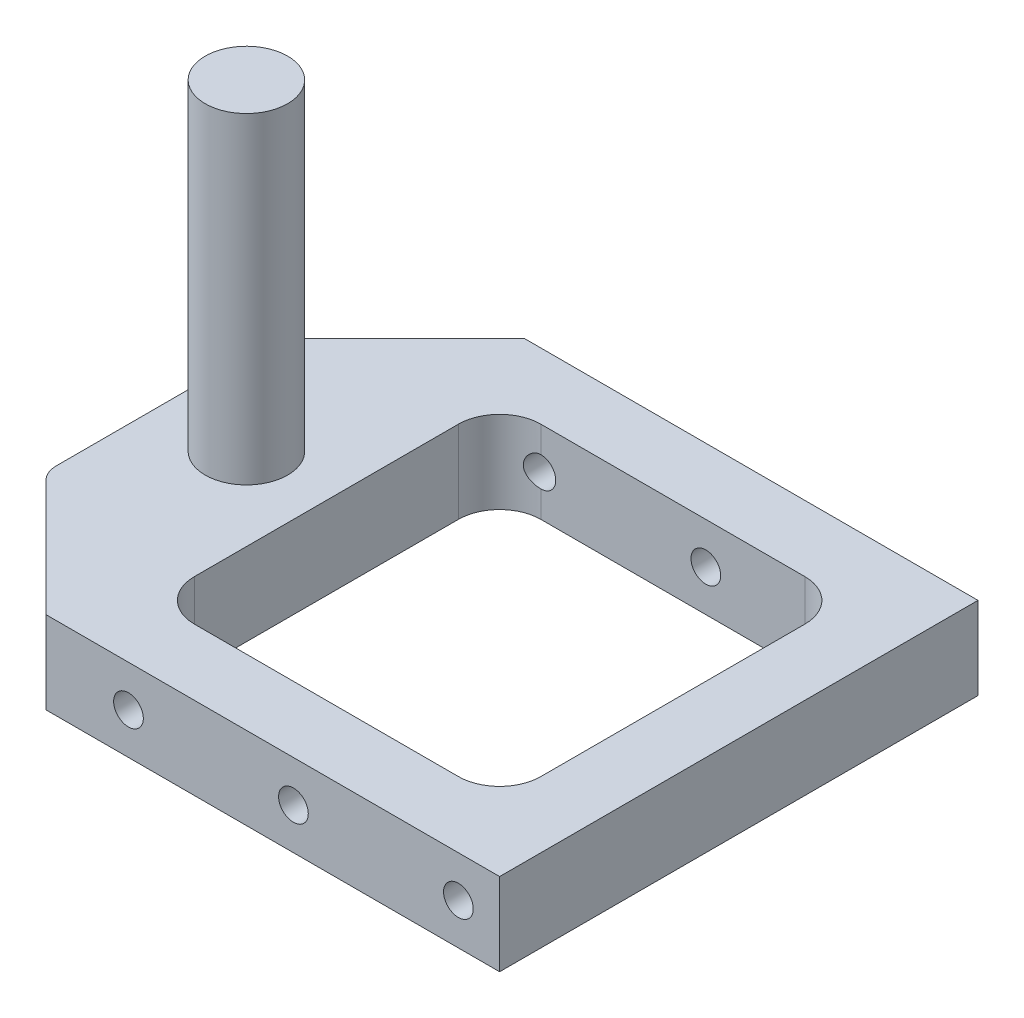
ISO-10303-21;
HEADER;
FILE_DESCRIPTION(('STEP AP214'),'2;1');
FILE_NAME('part.step','',(''),(''),'','','');
FILE_SCHEMA(('AUTOMOTIVE_DESIGN { 1 0 10303 214 1 1 1 1 }'));
ENDSEC;
DATA;
#1=APPLICATION_CONTEXT('core data for automotive mechanical design processes');
#2=APPLICATION_PROTOCOL_DEFINITION('international standard','automotive_design',2000,#1);
#3=PRODUCT_CONTEXT('',#1,'mechanical');
#4=PRODUCT('Part','Part','',(#3));
#5=PRODUCT_RELATED_PRODUCT_CATEGORY('part','',(#4));
#6=PRODUCT_DEFINITION_FORMATION('','',#4);
#7=PRODUCT_DEFINITION_CONTEXT('part definition',#1,'design');
#8=PRODUCT_DEFINITION('design','',#6,#7);
#9=PRODUCT_DEFINITION_SHAPE('','',#8);
#10=(LENGTH_UNIT() NAMED_UNIT(*) SI_UNIT(.MILLI.,.METRE.));
#11=(NAMED_UNIT(*) PLANE_ANGLE_UNIT() SI_UNIT($,.RADIAN.));
#12=(NAMED_UNIT(*) SI_UNIT($,.STERADIAN.) SOLID_ANGLE_UNIT());
#13=UNCERTAINTY_MEASURE_WITH_UNIT(LENGTH_MEASURE(1.E-05),#10,'distance_accuracy_value','');
#14=(GEOMETRIC_REPRESENTATION_CONTEXT(3) GLOBAL_UNCERTAINTY_ASSIGNED_CONTEXT((#13)) GLOBAL_UNIT_ASSIGNED_CONTEXT((#10,
#11,#12)) REPRESENTATION_CONTEXT('',''));
#15=CARTESIAN_POINT('',(0.,0.,0.));
#16=DIRECTION('',(0.,0.,1.));
#17=DIRECTION('',(1.,0.,0.));
#18=AXIS2_PLACEMENT_3D('',#15,#16,#17);
#19=CARTESIAN_POINT('',(24.9677831353781,-105.,58.));
#20=DIRECTION('',(-1.,0.,0.));
#21=DIRECTION('',(0.,0.,1.));
#22=AXIS2_PLACEMENT_3D('',#19,#20,#21);
#23=PLANE('',#22);
#24=DIRECTION('',(0.,1.,0.));
#25=VECTOR('',#24,1.);
#26=CARTESIAN_POINT('',(24.9677831353781,-105.,0.));
#27=LINE('',#26,#25);
#28=CARTESIAN_POINT('',(24.9677831353781,-105.,0.));
#29=VERTEX_POINT('',#28);
#30=CARTESIAN_POINT('',(24.9677831353781,-95.,0.));
#31=VERTEX_POINT('',#30);
#32=EDGE_CURVE('E222',#29,#31,#27,.T.);
#33=ORIENTED_EDGE('',*,*,#32,.T.);
#34=DIRECTION('',(0.,0.,-1.));
#35=VECTOR('',#34,1.);
#36=CARTESIAN_POINT('',(24.9677831353781,-95.,58.));
#37=LINE('',#36,#35);
#38=CARTESIAN_POINT('',(24.9677831353781,-95.,58.));
#39=VERTEX_POINT('',#38);
#40=EDGE_CURVE('E247',#39,#31,#37,.T.);
#41=ORIENTED_EDGE('',*,*,#40,.F.);
#42=DIRECTION('',(0.,1.,0.));
#43=VECTOR('',#42,1.);
#44=CARTESIAN_POINT('',(24.9677831353781,-105.,58.));
#45=LINE('',#44,#43);
#46=CARTESIAN_POINT('',(24.9677831353781,-105.,58.));
#47=VERTEX_POINT('',#46);
#48=EDGE_CURVE('E223',#47,#39,#45,.T.);
#49=ORIENTED_EDGE('',*,*,#48,.F.);
#50=DIRECTION('',(0.,0.,-1.));
#51=VECTOR('',#50,1.);
#52=CARTESIAN_POINT('',(24.9677831353781,-105.,58.));
#53=LINE('',#52,#51);
#54=EDGE_CURVE('E232',#47,#29,#53,.T.);
#55=ORIENTED_EDGE('',*,*,#54,.T.);
#56=EDGE_LOOP('',(#33,#41,#49,#55));
#57=FACE_BOUND('',#56,.T.);
#58=ADVANCED_FACE('F47',(#57),#23,.F.);
#59=CARTESIAN_POINT('',(24.9677831353781,-95.,58.));
#60=DIRECTION('',(0.,-1.,0.));
#61=DIRECTION('',(1.,0.,0.));
#62=AXIS2_PLACEMENT_3D('',#59,#60,#61);
#63=PLANE('',#62);
#64=DIRECTION('',(0.,0.,-1.));
#65=VECTOR('',#64,1.);
#66=CARTESIAN_POINT('',(-25.0322168646219,-95.,58.));
#67=LINE('',#66,#65);
#68=CARTESIAN_POINT('',(-25.0322168646219,-95.,45.));
#69=VERTEX_POINT('',#68);
#70=CARTESIAN_POINT('',(-25.0322168646219,-95.,13.));
#71=VERTEX_POINT('',#70);
#72=EDGE_CURVE('E211',#69,#71,#67,.T.);
#73=ORIENTED_EDGE('',*,*,#72,.T.);
#74=CARTESIAN_POINT('',(-20.0322168646219,-95.,13.));
#75=DIRECTION('',(0.,-1.,0.));
#76=DIRECTION('',(1.,0.,0.));
#77=AXIS2_PLACEMENT_3D('',#74,#75,#76);
#78=CIRCLE('',#77,5.);
#79=CARTESIAN_POINT('',(-20.0322168646219,-95.,8.));
#80=VERTEX_POINT('',#79);
#81=EDGE_CURVE('E214',#71,#80,#78,.T.);
#82=ORIENTED_EDGE('',*,*,#81,.T.);
#83=DIRECTION('',(1.,0.,0.));
#84=VECTOR('',#83,1.);
#85=CARTESIAN_POINT('',(24.9677831353781,-95.,8.));
#86=LINE('',#85,#84);
#87=CARTESIAN_POINT('',(11.9677831353781,-95.,8.));
#88=VERTEX_POINT('',#87);
#89=EDGE_CURVE('E186',#80,#88,#86,.T.);
#90=ORIENTED_EDGE('',*,*,#89,.T.);
#91=CARTESIAN_POINT('',(11.9677831353781,-95.,13.));
#92=DIRECTION('',(0.,-1.,0.));
#93=DIRECTION('',(1.,0.,0.));
#94=AXIS2_PLACEMENT_3D('',#91,#92,#93);
#95=CIRCLE('',#94,5.);
#96=CARTESIAN_POINT('',(16.9677831353781,-95.,13.));
#97=VERTEX_POINT('',#96);
#98=EDGE_CURVE('E195',#88,#97,#95,.T.);
#99=ORIENTED_EDGE('',*,*,#98,.T.);
#100=DIRECTION('',(0.,0.,1.));
#101=VECTOR('',#100,1.);
#102=CARTESIAN_POINT('',(16.9677831353781,-95.,58.));
#103=LINE('',#102,#101);
#104=CARTESIAN_POINT('',(16.9677831353781,-95.,45.));
#105=VERTEX_POINT('',#104);
#106=EDGE_CURVE('E199',#97,#105,#103,.T.);
#107=ORIENTED_EDGE('',*,*,#106,.T.);
#108=CARTESIAN_POINT('',(11.9677831353781,-95.,45.));
#109=DIRECTION('',(0.,-1.,0.));
#110=DIRECTION('',(1.,0.,0.));
#111=AXIS2_PLACEMENT_3D('',#108,#109,#110);
#112=CIRCLE('',#111,5.);
#113=CARTESIAN_POINT('',(11.9677831353781,-95.,50.));
#114=VERTEX_POINT('',#113);
#115=EDGE_CURVE('E202',#105,#114,#112,.T.);
#116=ORIENTED_EDGE('',*,*,#115,.T.);
#117=DIRECTION('',(-1.,0.,0.));
#118=VECTOR('',#117,1.);
#119=CARTESIAN_POINT('',(24.9677831353781,-95.,50.));
#120=LINE('',#119,#118);
#121=CARTESIAN_POINT('',(-20.0322168646219,-95.,50.));
#122=VERTEX_POINT('',#121);
#123=EDGE_CURVE('E205',#114,#122,#120,.T.);
#124=ORIENTED_EDGE('',*,*,#123,.T.);
#125=CARTESIAN_POINT('',(-20.0322168646219,-95.,45.));
#126=DIRECTION('',(0.,-1.,0.));
#127=DIRECTION('',(1.,0.,0.));
#128=AXIS2_PLACEMENT_3D('',#125,#126,#127);
#129=CIRCLE('',#128,5.);
#130=EDGE_CURVE('E208',#122,#69,#129,.T.);
#131=ORIENTED_EDGE('',*,*,#130,.T.);
#132=EDGE_LOOP('',(#73,#82,#90,#99,#107,#116,#124,#131));
#133=FACE_BOUND('',#132,.T.);
#134=CARTESIAN_POINT('',(-35.0322168646219,-95.,28.6999999999998));
#135=DIRECTION('',(0.,-1.,0.));
#136=DIRECTION('',(1.,0.,0.));
#137=AXIS2_PLACEMENT_3D('',#134,#135,#136);
#138=CIRCLE('',#137,5.);
#139=CARTESIAN_POINT('',(-30.0322168646219,-95.,28.6999999999998));
#140=VERTEX_POINT('',#139);
#141=EDGE_CURVE('E219',#140,#140,#138,.T.);
#142=ORIENTED_EDGE('',*,*,#141,.T.);
#143=EDGE_LOOP('',(#142));
#144=FACE_BOUND('',#143,.T.);
#145=DIRECTION('',(0.707106781186549,0.,-0.707106781186546));
#146=VECTOR('',#145,1.);
#147=CARTESIAN_POINT('',(-45.0322168646219,-95.,15.));
#148=LINE('',#147,#146);
#149=CARTESIAN_POINT('',(-30.0322168646219,-95.,0.));
#150=VERTEX_POINT('',#149);
#151=CARTESIAN_POINT('',(-44.1535372081816,-95.,14.1213203435596));
#152=VERTEX_POINT('',#151);
#153=EDGE_CURVE('E259',#150,#152,#148,.F.);
#154=ORIENTED_EDGE('',*,*,#153,.T.);
#155=CARTESIAN_POINT('',(-42.0322168646219,-95.,16.2426406871193));
#156=DIRECTION('',(0.,-1.,0.));
#157=DIRECTION('',(1.,0.,0.));
#158=AXIS2_PLACEMENT_3D('',#155,#156,#157);
#159=CIRCLE('',#158,3.);
#160=CARTESIAN_POINT('',(-45.0322168646219,-95.,16.2426406871193));
#161=VERTEX_POINT('',#160);
#162=EDGE_CURVE('E279',#152,#161,#159,.F.);
#163=ORIENTED_EDGE('',*,*,#162,.T.);
#164=DIRECTION('',(0.,0.,-1.));
#165=VECTOR('',#164,1.);
#166=CARTESIAN_POINT('',(-45.0322168646219,-95.,58.));
#167=LINE('',#166,#165);
#168=CARTESIAN_POINT('',(-45.0322168646219,-95.,41.7573593128807));
#169=VERTEX_POINT('',#168);
#170=EDGE_CURVE('E244',#169,#161,#167,.T.);
#171=ORIENTED_EDGE('',*,*,#170,.F.);
#172=CARTESIAN_POINT('',(-42.0322168646219,-95.,41.7573593128807));
#173=DIRECTION('',(0.,-1.,0.));
#174=DIRECTION('',(1.,0.,0.));
#175=AXIS2_PLACEMENT_3D('',#172,#173,#174);
#176=CIRCLE('',#175,3.);
#177=CARTESIAN_POINT('',(-44.1535372081816,-95.,43.8786796564403));
#178=VERTEX_POINT('',#177);
#179=EDGE_CURVE('E277',#169,#178,#176,.F.);
#180=ORIENTED_EDGE('',*,*,#179,.T.);
#181=DIRECTION('',(0.707106781186546,0.,0.707106781186549));
#182=VECTOR('',#181,1.);
#183=CARTESIAN_POINT('',(-30.0322168646219,-95.,58.));
#184=LINE('',#183,#182);
#185=CARTESIAN_POINT('',(-30.0322168646219,-95.,58.));
#186=VERTEX_POINT('',#185);
#187=EDGE_CURVE('E257',#178,#186,#184,.T.);
#188=ORIENTED_EDGE('',*,*,#187,.T.);
#189=DIRECTION('',(-1.,0.,0.));
#190=VECTOR('',#189,1.);
#191=CARTESIAN_POINT('',(24.9677831353781,-95.,58.));
#192=LINE('',#191,#190);
#193=EDGE_CURVE('E226',#39,#186,#192,.T.);
#194=ORIENTED_EDGE('',*,*,#193,.F.);
#195=ORIENTED_EDGE('',*,*,#40,.T.);
#196=DIRECTION('',(-1.,0.,0.));
#197=VECTOR('',#196,1.);
#198=CARTESIAN_POINT('',(24.9677831353781,-95.,0.));
#199=LINE('',#198,#197);
#200=EDGE_CURVE('E235',#31,#150,#199,.T.);
#201=ORIENTED_EDGE('',*,*,#200,.T.);
#202=EDGE_LOOP('',(#154,#163,#171,#180,#188,#194,#195,#201));
#203=FACE_BOUND('',#202,.T.);
#204=ADVANCED_FACE('F358',(#133,#144,#203),#63,.F.);
#205=CARTESIAN_POINT('',(-45.0322168646219,-105.,58.));
#206=DIRECTION('',(1.,0.,0.));
#207=DIRECTION('',(0.,0.,-1.));
#208=AXIS2_PLACEMENT_3D('',#205,#206,#207);
#209=PLANE('',#208);
#210=ORIENTED_EDGE('',*,*,#170,.T.);
#211=DIRECTION('',(0.,1.,0.));
#212=VECTOR('',#211,1.);
#213=CARTESIAN_POINT('',(-45.0322168646219,-105.,16.2426406871193));
#214=LINE('',#213,#212);
#215=CARTESIAN_POINT('',(-45.0322168646219,-105.,16.2426406871193));
#216=VERTEX_POINT('',#215);
#217=EDGE_CURVE('E268',#161,#216,#214,.F.);
#218=ORIENTED_EDGE('',*,*,#217,.T.);
#219=DIRECTION('',(0.,0.,-1.));
#220=VECTOR('',#219,1.);
#221=CARTESIAN_POINT('',(-45.0322168646219,-105.,58.));
#222=LINE('',#221,#220);
#223=CARTESIAN_POINT('',(-45.0322168646219,-105.,41.7573593128807));
#224=VERTEX_POINT('',#223);
#225=EDGE_CURVE('E241',#224,#216,#222,.T.);
#226=ORIENTED_EDGE('',*,*,#225,.F.);
#227=DIRECTION('',(0.,1.,0.));
#228=VECTOR('',#227,1.);
#229=CARTESIAN_POINT('',(-45.0322168646219,-95.,41.7573593128807));
#230=LINE('',#229,#228);
#231=EDGE_CURVE('E265',#224,#169,#230,.T.);
#232=ORIENTED_EDGE('',*,*,#231,.T.);
#233=EDGE_LOOP('',(#210,#218,#226,#232));
#234=FACE_BOUND('',#233,.T.);
#235=ADVANCED_FACE('F364',(#234),#209,.F.);
#236=CARTESIAN_POINT('',(24.9677831353781,-105.,58.));
#237=DIRECTION('',(0.,1.,0.));
#238=DIRECTION('',(-1.,0.,0.));
#239=AXIS2_PLACEMENT_3D('',#236,#237,#238);
#240=PLANE('',#239);
#241=DIRECTION('',(1.,0.,0.));
#242=VECTOR('',#241,1.);
#243=CARTESIAN_POINT('',(-20.0322168646219,-105.,8.));
#244=LINE('',#243,#242);
#245=CARTESIAN_POINT('',(-20.0322168646219,-105.,8.));
#246=VERTEX_POINT('',#245);
#247=CARTESIAN_POINT('',(11.9677831353781,-105.,8.));
#248=VERTEX_POINT('',#247);
#249=EDGE_CURVE('E523',#246,#248,#244,.T.);
#250=ORIENTED_EDGE('',*,*,#249,.F.);
#251=CARTESIAN_POINT('',(-20.0322168646219,-105.,13.));
#252=DIRECTION('',(0.,-1.,0.));
#253=DIRECTION('',(1.,0.,0.));
#254=AXIS2_PLACEMENT_3D('',#251,#252,#253);
#255=CIRCLE('',#254,5.);
#256=CARTESIAN_POINT('',(-25.0322168646219,-105.,13.));
#257=VERTEX_POINT('',#256);
#258=EDGE_CURVE('E522',#257,#246,#255,.T.);
#259=ORIENTED_EDGE('',*,*,#258,.F.);
#260=DIRECTION('',(0.,0.,-1.));
#261=VECTOR('',#260,1.);
#262=CARTESIAN_POINT('',(-25.0322168646219,-105.,45.));
#263=LINE('',#262,#261);
#264=CARTESIAN_POINT('',(-25.0322168646219,-105.,45.));
#265=VERTEX_POINT('',#264);
#266=EDGE_CURVE('E191',#265,#257,#263,.T.);
#267=ORIENTED_EDGE('',*,*,#266,.F.);
#268=CARTESIAN_POINT('',(-20.0322168646219,-105.,45.));
#269=DIRECTION('',(0.,-1.,0.));
#270=DIRECTION('',(1.,0.,0.));
#271=AXIS2_PLACEMENT_3D('',#268,#269,#270);
#272=CIRCLE('',#271,5.);
#273=CARTESIAN_POINT('',(-20.0322168646219,-105.,50.));
#274=VERTEX_POINT('',#273);
#275=EDGE_CURVE('E542',#274,#265,#272,.T.);
#276=ORIENTED_EDGE('',*,*,#275,.F.);
#277=DIRECTION('',(-1.,0.,0.));
#278=VECTOR('',#277,1.);
#279=CARTESIAN_POINT('',(-20.0322168646219,-105.,50.));
#280=LINE('',#279,#278);
#281=CARTESIAN_POINT('',(11.9677831353781,-105.,50.));
#282=VERTEX_POINT('',#281);
#283=EDGE_CURVE('E539',#282,#274,#280,.T.);
#284=ORIENTED_EDGE('',*,*,#283,.F.);
#285=CARTESIAN_POINT('',(11.9677831353781,-105.,45.));
#286=DIRECTION('',(0.,-1.,0.));
#287=DIRECTION('',(-1.,0.,0.));
#288=AXIS2_PLACEMENT_3D('',#285,#286,#287);
#289=CIRCLE('',#288,5.);
#290=CARTESIAN_POINT('',(16.9677831353781,-105.,45.));
#291=VERTEX_POINT('',#290);
#292=EDGE_CURVE('E536',#291,#282,#289,.T.);
#293=ORIENTED_EDGE('',*,*,#292,.F.);
#294=DIRECTION('',(0.,0.,1.));
#295=VECTOR('',#294,1.);
#296=CARTESIAN_POINT('',(16.9677831353781,-105.,45.));
#297=LINE('',#296,#295);
#298=CARTESIAN_POINT('',(16.9677831353781,-105.,13.));
#299=VERTEX_POINT('',#298);
#300=EDGE_CURVE('E533',#299,#291,#297,.T.);
#301=ORIENTED_EDGE('',*,*,#300,.F.);
#302=CARTESIAN_POINT('',(11.9677831353781,-105.,13.));
#303=DIRECTION('',(0.,-1.,0.));
#304=DIRECTION('',(1.,0.,0.));
#305=AXIS2_PLACEMENT_3D('',#302,#303,#304);
#306=CIRCLE('',#305,5.);
#307=EDGE_CURVE('E528',#248,#299,#306,.T.);
#308=ORIENTED_EDGE('',*,*,#307,.F.);
#309=EDGE_LOOP('',(#250,#259,#267,#276,#284,#293,#301,#308));
#310=FACE_BOUND('',#309,.T.);
#311=ORIENTED_EDGE('',*,*,#225,.T.);
#312=CARTESIAN_POINT('',(-42.0322168646219,-105.,16.2426406871193));
#313=DIRECTION('',(0.,1.,0.));
#314=DIRECTION('',(-1.,0.,0.));
#315=AXIS2_PLACEMENT_3D('',#312,#313,#314);
#316=CIRCLE('',#315,3.);
#317=CARTESIAN_POINT('',(-44.1535372081816,-105.,14.1213203435596));
#318=VERTEX_POINT('',#317);
#319=EDGE_CURVE('E273',#216,#318,#316,.F.);
#320=ORIENTED_EDGE('',*,*,#319,.T.);
#321=DIRECTION('',(-0.707106781186549,0.,0.707106781186546));
#322=VECTOR('',#321,1.);
#323=CARTESIAN_POINT('',(-45.0322168646219,-105.,15.));
#324=LINE('',#323,#322);
#325=CARTESIAN_POINT('',(-30.0322168646219,-105.,0.));
#326=VERTEX_POINT('',#325);
#327=EDGE_CURVE('E253',#318,#326,#324,.F.);
#328=ORIENTED_EDGE('',*,*,#327,.T.);
#329=DIRECTION('',(1.,0.,0.));
#330=VECTOR('',#329,1.);
#331=CARTESIAN_POINT('',(24.9677831353781,-105.,0.));
#332=LINE('',#331,#330);
#333=EDGE_CURVE('E227',#326,#29,#332,.T.);
#334=ORIENTED_EDGE('',*,*,#333,.T.);
#335=ORIENTED_EDGE('',*,*,#54,.F.);
#336=DIRECTION('',(1.,0.,0.));
#337=VECTOR('',#336,1.);
#338=CARTESIAN_POINT('',(24.9677831353781,-105.,58.));
#339=LINE('',#338,#337);
#340=CARTESIAN_POINT('',(-30.0322168646219,-105.,58.));
#341=VERTEX_POINT('',#340);
#342=EDGE_CURVE('E230',#341,#47,#339,.T.);
#343=ORIENTED_EDGE('',*,*,#342,.F.);
#344=DIRECTION('',(-0.707106781186546,0.,-0.707106781186549));
#345=VECTOR('',#344,1.);
#346=CARTESIAN_POINT('',(-30.0322168646219,-105.,58.));
#347=LINE('',#346,#345);
#348=CARTESIAN_POINT('',(-44.1535372081816,-105.,43.8786796564403));
#349=VERTEX_POINT('',#348);
#350=EDGE_CURVE('E250',#341,#349,#347,.T.);
#351=ORIENTED_EDGE('',*,*,#350,.T.);
#352=CARTESIAN_POINT('',(-42.0322168646219,-105.,41.7573593128807));
#353=DIRECTION('',(0.,1.,0.));
#354=DIRECTION('',(-1.,0.,0.));
#355=AXIS2_PLACEMENT_3D('',#352,#353,#354);
#356=CIRCLE('',#355,3.);
#357=EDGE_CURVE('E271',#349,#224,#356,.F.);
#358=ORIENTED_EDGE('',*,*,#357,.T.);
#359=EDGE_LOOP('',(#311,#320,#328,#334,#335,#343,#351,#358));
#360=FACE_BOUND('',#359,.T.);
#361=ADVANCED_FACE('F396',(#310,#360),#240,.F.);
#362=CARTESIAN_POINT('',(0.,0.,58.));
#363=DIRECTION('',(0.,0.,1.));
#364=DIRECTION('',(1.,0.,0.));
#365=AXIS2_PLACEMENT_3D('',#362,#363,#364);
#366=PLANE('',#365);
#367=CARTESIAN_POINT('',(-20.0322168646201,-100.000000000002,58.));
#368=DIRECTION('',(0.,0.,1.));
#369=DIRECTION('',(1.,0.,0.));
#370=AXIS2_PLACEMENT_3D('',#367,#368,#369);
#371=CIRCLE('',#370,1.79999999999889);
#372=CARTESIAN_POINT('',(-18.2322168646212,-100.000000000002,58.));
#373=VERTEX_POINT('',#372);
#374=EDGE_CURVE('E285',#373,#373,#371,.T.);
#375=ORIENTED_EDGE('',*,*,#374,.F.);
#376=EDGE_LOOP('',(#375));
#377=FACE_BOUND('',#376,.T.);
#378=CARTESIAN_POINT('',(-0.0322168646201307,-100.000000000002,58.));
#379=DIRECTION('',(0.,0.,1.));
#380=DIRECTION('',(1.,0.,0.));
#381=AXIS2_PLACEMENT_3D('',#378,#379,#380);
#382=CIRCLE('',#381,1.79999999999888);
#383=CARTESIAN_POINT('',(1.76778313537875,-100.000000000002,58.));
#384=VERTEX_POINT('',#383);
#385=EDGE_CURVE('E291',#384,#384,#382,.T.);
#386=ORIENTED_EDGE('',*,*,#385,.F.);
#387=EDGE_LOOP('',(#386));
#388=FACE_BOUND('',#387,.T.);
#389=CARTESIAN_POINT('',(19.9677831353799,-100.000000000002,58.));
#390=DIRECTION('',(0.,0.,1.));
#391=DIRECTION('',(1.,0.,0.));
#392=AXIS2_PLACEMENT_3D('',#389,#390,#391);
#393=CIRCLE('',#392,1.79999999999887);
#394=CARTESIAN_POINT('',(21.7677831353787,-100.000000000002,58.));
#395=VERTEX_POINT('',#394);
#396=EDGE_CURVE('E296',#395,#395,#393,.T.);
#397=ORIENTED_EDGE('',*,*,#396,.F.);
#398=EDGE_LOOP('',(#397));
#399=FACE_BOUND('',#398,.T.);
#400=ORIENTED_EDGE('',*,*,#193,.T.);
#401=DIRECTION('',(0.,-1.,0.));
#402=VECTOR('',#401,1.);
#403=CARTESIAN_POINT('',(-30.0322168646219,-105.,58.));
#404=LINE('',#403,#402);
#405=EDGE_CURVE('E262',#186,#341,#404,.T.);
#406=ORIENTED_EDGE('',*,*,#405,.T.);
#407=ORIENTED_EDGE('',*,*,#342,.T.);
#408=ORIENTED_EDGE('',*,*,#48,.T.);
#409=EDGE_LOOP('',(#400,#406,#407,#408));
#410=FACE_BOUND('',#409,.T.);
#411=ADVANCED_FACE('F393',(#377,#388,#399,#410),#366,.T.);
#412=CARTESIAN_POINT('',(0.,0.,0.));
#413=DIRECTION('',(0.,0.,1.));
#414=DIRECTION('',(1.,0.,0.));
#415=AXIS2_PLACEMENT_3D('',#412,#413,#414);
#416=PLANE('',#415);
#417=CARTESIAN_POINT('',(-20.0322168646201,-100.000000000002,0.));
#418=DIRECTION('',(0.,0.,1.));
#419=DIRECTION('',(1.,0.,0.));
#420=AXIS2_PLACEMENT_3D('',#417,#418,#419);
#421=CIRCLE('',#420,1.79999999999889);
#422=CARTESIAN_POINT('',(-18.2322168646212,-100.000000000002,0.));
#423=VERTEX_POINT('',#422);
#424=EDGE_CURVE('E325',#423,#423,#421,.T.);
#425=ORIENTED_EDGE('',*,*,#424,.T.);
#426=EDGE_LOOP('',(#425));
#427=FACE_BOUND('',#426,.T.);
#428=CARTESIAN_POINT('',(-0.0322168646201307,-100.000000000002,0.));
#429=DIRECTION('',(0.,0.,1.));
#430=DIRECTION('',(1.,0.,0.));
#431=AXIS2_PLACEMENT_3D('',#428,#429,#430);
#432=CIRCLE('',#431,1.79999999999888);
#433=CARTESIAN_POINT('',(1.76778313537875,-100.000000000002,0.));
#434=VERTEX_POINT('',#433);
#435=EDGE_CURVE('E182',#434,#434,#432,.T.);
#436=ORIENTED_EDGE('',*,*,#435,.T.);
#437=EDGE_LOOP('',(#436));
#438=FACE_BOUND('',#437,.T.);
#439=CARTESIAN_POINT('',(19.9677831353799,-100.000000000002,0.));
#440=DIRECTION('',(0.,0.,1.));
#441=DIRECTION('',(1.,0.,0.));
#442=AXIS2_PLACEMENT_3D('',#439,#440,#441);
#443=CIRCLE('',#442,1.79999999999887);
#444=CARTESIAN_POINT('',(21.7677831353787,-100.000000000002,0.));
#445=VERTEX_POINT('',#444);
#446=EDGE_CURVE('E51',#445,#445,#443,.T.);
#447=ORIENTED_EDGE('',*,*,#446,.T.);
#448=EDGE_LOOP('',(#447));
#449=FACE_BOUND('',#448,.T.);
#450=ORIENTED_EDGE('',*,*,#333,.F.);
#451=DIRECTION('',(0.,1.,0.));
#452=VECTOR('',#451,1.);
#453=CARTESIAN_POINT('',(-30.0322168646219,0.,0.));
#454=LINE('',#453,#452);
#455=EDGE_CURVE('E255',#326,#150,#454,.T.);
#456=ORIENTED_EDGE('',*,*,#455,.T.);
#457=ORIENTED_EDGE('',*,*,#200,.F.);
#458=ORIENTED_EDGE('',*,*,#32,.F.);
#459=EDGE_LOOP('',(#450,#456,#457,#458));
#460=FACE_BOUND('',#459,.T.);
#461=ADVANCED_FACE('F404',(#427,#438,#449,#460),#416,.F.);
#462=CARTESIAN_POINT('',(-35.0322168646219,-56.,28.6999999999998));
#463=DIRECTION('',(0.,-1.,0.));
#464=DIRECTION('',(1.,0.,0.));
#465=AXIS2_PLACEMENT_3D('',#462,#463,#464);
#466=CYLINDRICAL_SURFACE('',#465,5.);
#467=CARTESIAN_POINT('',(-35.0322168646219,-56.,28.6999999999998));
#468=DIRECTION('',(0.,-1.,0.));
#469=DIRECTION('',(1.,0.,0.));
#470=AXIS2_PLACEMENT_3D('',#467,#468,#469);
#471=CIRCLE('',#470,5.);
#472=CARTESIAN_POINT('',(-30.0322168646219,-56.,28.6999999999998));
#473=VERTEX_POINT('',#472);
#474=EDGE_CURVE('E216',#473,#473,#471,.T.);
#475=ORIENTED_EDGE('',*,*,#474,.T.);
#476=EDGE_LOOP('',(#475));
#477=FACE_BOUND('',#476,.T.);
#478=ORIENTED_EDGE('',*,*,#141,.F.);
#479=EDGE_LOOP('',(#478));
#480=FACE_BOUND('',#479,.T.);
#481=ADVANCED_FACE('F406',(#477,#480),#466,.T.);
#482=CARTESIAN_POINT('',(-35.0322168646219,-56.,28.6999999999998));
#483=DIRECTION('',(0.,-1.,0.));
#484=DIRECTION('',(1.,0.,0.));
#485=AXIS2_PLACEMENT_3D('',#482,#483,#484);
#486=PLANE('',#485);
#487=ORIENTED_EDGE('',*,*,#474,.F.);
#488=EDGE_LOOP('',(#487));
#489=FACE_BOUND('',#488,.T.);
#490=ADVANCED_FACE('F413',(#489),#486,.F.);
#491=CARTESIAN_POINT('',(-20.0322168646219,-75.,13.));
#492=DIRECTION('',(0.,-1.,0.));
#493=DIRECTION('',(1.,0.,0.));
#494=AXIS2_PLACEMENT_3D('',#491,#492,#493);
#495=CYLINDRICAL_SURFACE('',#494,5.);
#496=DIRECTION('',(0.,-1.,0.));
#497=VECTOR('',#496,1.);
#498=CARTESIAN_POINT('',(-20.0322168646219,-75.,8.));
#499=LINE('',#498,#497);
#500=CARTESIAN_POINT('',(-20.0322168646219,-101.800000000001,8.));
#501=VERTEX_POINT('',#500);
#502=EDGE_CURVE('E180',#501,#246,#499,.T.);
#503=ORIENTED_EDGE('',*,*,#502,.F.);
#504=CARTESIAN_POINT('',(-18.2322168646212,-100.000000000002,8.33523848412402));
#505=CARTESIAN_POINT('',(-18.2322145268163,-100.097521545267,8.335240555247));
#506=CARTESIAN_POINT('',(-18.2401687842376,-100.195027023344,8.33214700183259));
#507=CARTESIAN_POINT('',(-18.2716450123121,-100.387116957008,8.32018528833198));
#508=CARTESIAN_POINT('',(-18.295167546331,-100.481701306758,8.31131691927397));
#509=CARTESIAN_POINT('',(-18.3568207726413,-100.665127513043,8.2889375321347));
#510=CARTESIAN_POINT('',(-18.3949188927132,-100.753981661233,8.27543687277238));
#511=CARTESIAN_POINT('',(-18.4845278128859,-100.924070084807,8.24533015944487));
#512=CARTESIAN_POINT('',(-18.5360422803752,-101.005302268437,8.22872325673146));
#513=CARTESIAN_POINT('',(-18.6535452620977,-101.161556101335,8.19342390825406));
#514=CARTESIAN_POINT('',(-18.7200464013615,-101.236179256038,8.17467346708966));
#515=CARTESIAN_POINT('',(-18.8645449828048,-101.37349159379,8.13768585308889));
#516=CARTESIAN_POINT('',(-18.9425446329949,-101.436178479456,8.11944877963519));
#517=CARTESIAN_POINT('',(-19.1108095657703,-101.549716427416,8.08486006259947));
#518=CARTESIAN_POINT('',(-19.2013802107921,-101.600140156134,8.06858442788552));
#519=CARTESIAN_POINT('',(-19.3904068964998,-101.684873075604,8.04044433868089));
#520=CARTESIAN_POINT('',(-19.4888604205581,-101.719187385504,8.02857848312903));
#521=CARTESIAN_POINT('',(-19.6866727677716,-101.769347154239,8.0110062438546));
#522=CARTESIAN_POINT('',(-19.7858373339469,-101.785877393448,8.00507215872108));
#523=CARTESIAN_POINT('',(-19.9856985885103,-101.802187667126,7.99921821756203));
#524=CARTESIAN_POINT('',(-20.0863948084558,-101.801972723919,7.99929655825072));
#525=CARTESIAN_POINT('',(-20.2815757058915,-101.78521081662,8.00531025244531));
#526=CARTESIAN_POINT('',(-20.3761340943599,-101.769409872651,8.01097806452151));
#527=CARTESIAN_POINT('',(-20.5611544586154,-101.723171473156,8.0271885470759));
#528=CARTESIAN_POINT('',(-20.6516161471147,-101.692732992882,8.03773155885612));
#529=CARTESIAN_POINT('',(-20.827385867482,-101.617704809953,8.06282409679447));
#530=CARTESIAN_POINT('',(-20.9126031271427,-101.572921417889,8.07742807696898));
#531=CARTESIAN_POINT('',(-21.0745177850063,-101.470641297186,8.10914876882149));
#532=CARTESIAN_POINT('',(-21.1512125505362,-101.413140656389,8.12626625317316));
#533=CARTESIAN_POINT('',(-21.2983185007906,-101.283401107404,8.16233182778982));
#534=CARTESIAN_POINT('',(-21.3681621340763,-101.210531323941,8.18132884879522));
#535=CARTESIAN_POINT('',(-21.4948406932322,-101.05397988253,8.21825392025956));
#536=CARTESIAN_POINT('',(-21.551672858969,-100.970295936444,8.23618174331329));
#537=CARTESIAN_POINT('',(-21.6516843526734,-100.792418693218,8.26923239075341));
#538=CARTESIAN_POINT('',(-21.694583068379,-100.698055607801,8.28429529565667));
#539=CARTESIAN_POINT('',(-21.7636742123302,-100.502761494668,8.30921961773618));
#540=CARTESIAN_POINT('',(-21.7898750661172,-100.401833807749,8.3190836577621));
#541=CARTESIAN_POINT('',(-21.8235865878933,-100.201846101279,8.3318842288681));
#542=CARTESIAN_POINT('',(-21.8319911643798,-100.102958038672,8.33515168087561));
#543=CARTESIAN_POINT('',(-21.8324334299607,-99.9051520404149,8.33532176253945));
#544=CARTESIAN_POINT('',(-21.8244747652019,-99.80623411633,8.33222581012431));
#545=CARTESIAN_POINT('',(-21.7932245434135,-99.6155613034285,8.32035180087585));
#546=CARTESIAN_POINT('',(-21.7705970596246,-99.5236805059264,8.31182010138523));
#547=CARTESIAN_POINT('',(-21.7114724896111,-99.3450523268802,8.29032028005662));
#548=CARTESIAN_POINT('',(-21.6749726990444,-99.2583059500809,8.27735129323916));
#549=CARTESIAN_POINT('',(-21.587676695122,-99.0889908976271,8.24787068615603));
#550=CARTESIAN_POINT('',(-21.5364191987065,-99.0066796396289,8.23124970057287));
#551=CARTESIAN_POINT('',(-21.4215651316486,-98.8515068944521,8.19653190894206));
#552=CARTESIAN_POINT('',(-21.3579643600684,-98.7786486386556,8.17843460165875));
#553=CARTESIAN_POINT('',(-21.215889653887,-98.6401035570673,8.14154341730839));
#554=CARTESIAN_POINT('',(-21.1367701541284,-98.575071290712,8.12276943883926));
#555=CARTESIAN_POINT('',(-20.9682779828244,-98.459141657064,8.08764973052352));
#556=CARTESIAN_POINT('',(-20.8789054536359,-98.4082440935534,8.07130396696988));
#557=CARTESIAN_POINT('',(-20.6926702434017,-98.3224251817028,8.0429222442306));
#558=CARTESIAN_POINT('',(-20.5958463632727,-98.2874268582917,8.03086558261191));
#559=CARTESIAN_POINT('',(-20.3971577973713,-98.2343901443743,8.01233990446743));
#560=CARTESIAN_POINT('',(-20.2952952923843,-98.2163444829766,8.00586849255968));
#561=CARTESIAN_POINT('',(-20.0953620456877,-98.198462512646,7.99945251111888));
#562=CARTESIAN_POINT('',(-19.9973847007549,-98.1976929975913,7.99917345873474));
#563=CARTESIAN_POINT('',(-19.8027598938665,-98.2120213238343,8.00431958863066));
#564=CARTESIAN_POINT('',(-19.7061122932286,-98.2271174975561,8.00974417142567));
#565=CARTESIAN_POINT('',(-19.5189431827732,-98.2721042882179,8.02554571502734));
#566=CARTESIAN_POINT('',(-19.4283355466659,-98.3016768164396,8.03581603250882));
#567=CARTESIAN_POINT('',(-19.2533493220621,-98.3744691568998,8.0602450746652));
#568=CARTESIAN_POINT('',(-19.1689719073892,-98.4176915328252,8.07440452972495));
#569=CARTESIAN_POINT('',(-19.0051152171526,-98.5185519039265,8.10589073940844));
#570=CARTESIAN_POINT('',(-18.9259714007032,-98.576701610806,8.12332231771397));
#571=CARTESIAN_POINT('',(-18.7782698819751,-98.7049364524148,8.15919387100883));
#572=CARTESIAN_POINT('',(-18.7097158406341,-98.775025697172,8.17763419175543));
#573=CARTESIAN_POINT('',(-18.5817923507946,-98.929129081318,8.21450995177099));
#574=CARTESIAN_POINT('',(-18.5230161373487,-99.0136475730915,8.2329032964822));
#575=CARTESIAN_POINT('',(-18.4205038156576,-99.1919452263175,8.26657581252241));
#576=CARTESIAN_POINT('',(-18.3767670804847,-99.2857240015409,8.28185511365095));
#577=CARTESIAN_POINT('',(-18.3054867901354,-99.4810443107301,8.30746691651465));
#578=CARTESIAN_POINT('',(-18.2781151738798,-99.5826560256937,8.31774668852199));
#579=CARTESIAN_POINT('',(-18.241486223481,-99.7895193556715,8.33162960376723));
#580=CARTESIAN_POINT('',(-18.2322193872379,-99.8947690318046,8.33523624927145));
#581=CARTESIAN_POINT('',(-18.2322168646212,-100.000000000002,8.33523848412402));
#582=B_SPLINE_CURVE_WITH_KNOTS('',3,(#504,#505,#506,#507,#508,#509,#510,#511,#512,#513,#514,
#515,#516,#517,#518,#519,#520,#521,#522,#523,#524,#525,#526,#527,#528,#529,#530,#531,#532,#533,
#534,#535,#536,#537,#538,#539,#540,#541,#542,#543,#544,#545,#546,#547,#548,#549,#550,#551,#552,
#553,#554,#555,#556,#557,#558,#559,#560,#561,#562,#563,#564,#565,#566,#567,#568,#569,#570,#571,
#572,#573,#574,#575,#576,#577,#578,#579,#580,#581),.UNSPECIFIED.,.T.,.F.,(4,2,2,2,2,2,2,2,2,2,2,
2,2,2,2,2,2,2,2,2,2,2,2,2,2,2,2,2,2,2,2,2,2,2,2,2,2,2,4),(0.,0.292173580883784,
0.584357735167874,0.875892720716046,1.16750748179789,1.47124350249638,1.77503792450006,
2.08825346989646,2.40136941618628,2.7019422179649,3.00242487034998,3.28919020584915,
3.57597562019991,3.86680921049234,4.15773239353383,4.46445707016179,4.77124675238727,
5.08387886117935,5.39635309438614,5.69271819359987,5.98901726228222,6.27275971337772,
6.5565575071502,6.85042427756033,7.14439123919843,7.45528614316877,7.76617673107947,
8.07554568921905,8.38478190027736,8.67727138046568,8.96973012139131,9.25603305055233,
9.54238978456492,9.84031183154965,10.1383366422718,10.4505611162065,10.7627725733392,
11.0782091067553,11.3934800421631),.UNSPECIFIED.);
#583=CARTESIAN_POINT('',(-20.0322168646219,-98.2000000000033,8.));
#584=VERTEX_POINT('',#583);
#585=EDGE_CURVE('E69',#501,#584,#582,.T.);
#586=ORIENTED_EDGE('',*,*,#585,.T.);
#587=EDGE_CURVE('E177',#80,#584,#499,.T.);
#588=ORIENTED_EDGE('',*,*,#587,.F.);
#589=ORIENTED_EDGE('',*,*,#81,.F.);
#590=DIRECTION('',(0.,-1.,0.));
#591=VECTOR('',#590,1.);
#592=CARTESIAN_POINT('',(-25.0322168646219,-75.,13.));
#593=LINE('',#592,#591);
#594=EDGE_CURVE('E196',#71,#257,#593,.T.);
#595=ORIENTED_EDGE('',*,*,#594,.T.);
#596=ORIENTED_EDGE('',*,*,#258,.T.);
#597=EDGE_LOOP('',(#503,#586,#588,#589,#595,#596));
#598=FACE_BOUND('',#597,.T.);
#599=ADVANCED_FACE('F176',(#598),#495,.F.);
#600=CARTESIAN_POINT('',(-25.0322168646219,-75.,45.));
#601=DIRECTION('',(-1.,0.,0.));
#602=DIRECTION('',(0.,-1.,0.));
#603=AXIS2_PLACEMENT_3D('',#600,#601,#602);
#604=PLANE('',#603);
#605=DIRECTION('',(0.,-1.,0.));
#606=VECTOR('',#605,1.);
#607=CARTESIAN_POINT('',(-25.0322168646219,-75.,45.));
#608=LINE('',#607,#606);
#609=EDGE_CURVE('E548',#69,#265,#608,.T.);
#610=ORIENTED_EDGE('',*,*,#609,.T.);
#611=ORIENTED_EDGE('',*,*,#266,.T.);
#612=ORIENTED_EDGE('',*,*,#594,.F.);
#613=ORIENTED_EDGE('',*,*,#72,.F.);
#614=EDGE_LOOP('',(#610,#611,#612,#613));
#615=FACE_BOUND('',#614,.T.);
#616=ADVANCED_FACE('F333',(#615),#604,.F.);
#617=CARTESIAN_POINT('',(-20.0322168646219,-75.,45.));
#618=DIRECTION('',(0.,-1.,0.));
#619=DIRECTION('',(1.,0.,0.));
#620=AXIS2_PLACEMENT_3D('',#617,#618,#619);
#621=CYLINDRICAL_SURFACE('',#620,5.);
#622=DIRECTION('',(0.,-1.,0.));
#623=VECTOR('',#622,1.);
#624=CARTESIAN_POINT('',(-20.0322168646219,-75.,50.));
#625=LINE('',#624,#623);
#626=CARTESIAN_POINT('',(-20.0322168646219,-98.2000000000033,50.));
#627=VERTEX_POINT('',#626);
#628=EDGE_CURVE('E550',#122,#627,#625,.T.);
#629=ORIENTED_EDGE('',*,*,#628,.T.);
#630=CARTESIAN_POINT('',(-18.2322168646212,-100.000000000002,49.664761515876));
#631=CARTESIAN_POINT('',(-18.2322145268163,-99.902478454737,49.664759444753));
#632=CARTESIAN_POINT('',(-18.2401687842376,-99.8049729766601,49.6678529981674));
#633=CARTESIAN_POINT('',(-18.2716450123121,-99.6128830429969,49.679814711668));
#634=CARTESIAN_POINT('',(-18.295167546331,-99.5182986932466,49.688683080726));
#635=CARTESIAN_POINT('',(-18.3568207726413,-99.3348724869617,49.7110624678653));
#636=CARTESIAN_POINT('',(-18.3949188927132,-99.246018338771,49.7245631272276));
#637=CARTESIAN_POINT('',(-18.4845278128859,-99.0759299151975,49.7546698405551));
#638=CARTESIAN_POINT('',(-18.5360422803752,-98.9946977315674,49.7712767432685));
#639=CARTESIAN_POINT('',(-18.6535452620977,-98.8384438986699,49.8065760917459));
#640=CARTESIAN_POINT('',(-18.7200464013615,-98.7638207439662,49.8253265329103));
#641=CARTESIAN_POINT('',(-18.8645449828048,-98.6265084062147,49.8623141469111));
#642=CARTESIAN_POINT('',(-18.9425446329949,-98.5638215205483,49.8805512203648));
#643=CARTESIAN_POINT('',(-19.1108095657703,-98.4502835725883,49.9151399374005));
#644=CARTESIAN_POINT('',(-19.2013802107921,-98.3998598438708,49.9314155721145));
#645=CARTESIAN_POINT('',(-19.3904068964998,-98.3151269244007,49.9595556613191));
#646=CARTESIAN_POINT('',(-19.4888604205581,-98.2808126145006,49.971421516871));
#647=CARTESIAN_POINT('',(-19.6866727677716,-98.2306528457653,49.9889937561454));
#648=CARTESIAN_POINT('',(-19.7858373339469,-98.2141226065564,49.9949278412789));
#649=CARTESIAN_POINT('',(-19.9856985885103,-98.1978123328783,50.000781782438));
#650=CARTESIAN_POINT('',(-20.0863948084558,-98.1980272760855,50.0007034417493));
#651=CARTESIAN_POINT('',(-20.2815757058915,-98.2147891833843,49.9946897475547));
#652=CARTESIAN_POINT('',(-20.3761340943599,-98.2305901273534,49.9890219354785));
#653=CARTESIAN_POINT('',(-20.5611544586154,-98.2768285268485,49.9728114529241));
#654=CARTESIAN_POINT('',(-20.6516161471147,-98.3072670071222,49.9622684411439));
#655=CARTESIAN_POINT('',(-20.827385867482,-98.3822951900514,49.9371759032055));
#656=CARTESIAN_POINT('',(-20.9126031271427,-98.4270785821153,49.922571923031));
#657=CARTESIAN_POINT('',(-21.0745177850063,-98.5293587028186,49.8908512311785));
#658=CARTESIAN_POINT('',(-21.1512125505362,-98.5868593436154,49.8737337468268));
#659=CARTESIAN_POINT('',(-21.2983185007906,-98.7165988926008,49.8376681722102));
#660=CARTESIAN_POINT('',(-21.3681621340763,-98.7894686760631,49.8186711512048));
#661=CARTESIAN_POINT('',(-21.4948406932322,-98.946020117474,49.7817460797404));
#662=CARTESIAN_POINT('',(-21.551672858969,-99.0297040635607,49.7638182566867));
#663=CARTESIAN_POINT('',(-21.6516843526734,-99.2075813067862,49.7307676092466));
#664=CARTESIAN_POINT('',(-21.694583068379,-99.3019443922032,49.7157047043433));
#665=CARTESIAN_POINT('',(-21.7636742123302,-99.4972385053367,49.6907803822638));
#666=CARTESIAN_POINT('',(-21.7898750661172,-99.5981661922549,49.6809163422379));
#667=CARTESIAN_POINT('',(-21.8235865878933,-99.798153898725,49.6681157711319));
#668=CARTESIAN_POINT('',(-21.8319911643798,-99.8970419613325,49.6648483191244));
#669=CARTESIAN_POINT('',(-21.8324334299607,-100.09484795959,49.6646782374605));
#670=CARTESIAN_POINT('',(-21.8244747652019,-100.193765883674,49.6677741898757));
#671=CARTESIAN_POINT('',(-21.7932245434135,-100.384438696576,49.6796481991241));
#672=CARTESIAN_POINT('',(-21.7705970596246,-100.476319494078,49.6881798986148));
#673=CARTESIAN_POINT('',(-21.7114724896111,-100.654947673124,49.7096797199434));
#674=CARTESIAN_POINT('',(-21.6749726990444,-100.741694049924,49.7226487067608));
#675=CARTESIAN_POINT('',(-21.587676695122,-100.911009102377,49.752129313844));
#676=CARTESIAN_POINT('',(-21.5364191987065,-100.993320360376,49.7687502994271));
#677=CARTESIAN_POINT('',(-21.4215651316486,-101.148493105552,49.8034680910579));
#678=CARTESIAN_POINT('',(-21.3579643600684,-101.221351361349,49.8215653983412));
#679=CARTESIAN_POINT('',(-21.2158896538869,-101.359896442937,49.8584565826916));
#680=CARTESIAN_POINT('',(-21.1367701541284,-101.424928709292,49.8772305611607));
#681=CARTESIAN_POINT('',(-20.9682779828244,-101.54085834294,49.9123502694765));
#682=CARTESIAN_POINT('',(-20.8789054536359,-101.591755906451,49.9286960330301));
#683=CARTESIAN_POINT('',(-20.6926702434017,-101.677574818302,49.9570777557694));
#684=CARTESIAN_POINT('',(-20.5958463632728,-101.712573141713,49.9691344173881));
#685=CARTESIAN_POINT('',(-20.3971577973713,-101.76560985563,49.9876600955326));
#686=CARTESIAN_POINT('',(-20.2952952923843,-101.783655517028,49.9941315074403));
#687=CARTESIAN_POINT('',(-20.0953620456877,-101.801537487358,50.0005474888811));
#688=CARTESIAN_POINT('',(-19.9973847007549,-101.802307002413,50.0008265412652));
#689=CARTESIAN_POINT('',(-19.8027598938665,-101.78797867617,49.9956804113693));
#690=CARTESIAN_POINT('',(-19.7061122932286,-101.772882502448,49.9902558285743));
#691=CARTESIAN_POINT('',(-19.5189431827732,-101.727895711787,49.9744542849727));
#692=CARTESIAN_POINT('',(-19.4283355466659,-101.698323183565,49.9641839674912));
#693=CARTESIAN_POINT('',(-19.2533493220621,-101.625530843105,49.9397549253348));
#694=CARTESIAN_POINT('',(-19.1689719073892,-101.582308467179,49.925595470275));
#695=CARTESIAN_POINT('',(-19.0051152171526,-101.481448096078,49.8941092605916));
#696=CARTESIAN_POINT('',(-18.9259714007032,-101.423298389198,49.876677682286));
#697=CARTESIAN_POINT('',(-18.7782698819751,-101.29506354759,49.8408061289912));
#698=CARTESIAN_POINT('',(-18.7097158406341,-101.224974302832,49.8223658082446));
#699=CARTESIAN_POINT('',(-18.5817923507946,-101.070870918686,49.785490048229));
#700=CARTESIAN_POINT('',(-18.5230161373487,-100.986352426913,49.7670967035178));
#701=CARTESIAN_POINT('',(-18.4205038156576,-100.808054773687,49.7334241874776));
#702=CARTESIAN_POINT('',(-18.3767670804847,-100.714275998463,49.718144886349));
#703=CARTESIAN_POINT('',(-18.3054867901354,-100.518955689274,49.6925330834853));
#704=CARTESIAN_POINT('',(-18.2781151738798,-100.417343974311,49.682253311478));
#705=CARTESIAN_POINT('',(-18.241486223481,-100.210480644333,49.6683703962328));
#706=CARTESIAN_POINT('',(-18.2322193872379,-100.1052309682,49.6647637507285));
#707=CARTESIAN_POINT('',(-18.2322168646212,-100.000000000002,49.664761515876));
#708=B_SPLINE_CURVE_WITH_KNOTS('',3,(#630,#631,#632,#633,#634,#635,#636,#637,#638,#639,#640,
#641,#642,#643,#644,#645,#646,#647,#648,#649,#650,#651,#652,#653,#654,#655,#656,#657,#658,#659,
#660,#661,#662,#663,#664,#665,#666,#667,#668,#669,#670,#671,#672,#673,#674,#675,#676,#677,#678,
#679,#680,#681,#682,#683,#684,#685,#686,#687,#688,#689,#690,#691,#692,#693,#694,#695,#696,#697,
#698,#699,#700,#701,#702,#703,#704,#705,#706,#707),.UNSPECIFIED.,.T.,.F.,(4,2,2,2,2,2,2,2,2,2,2,
2,2,2,2,2,2,2,2,2,2,2,2,2,2,2,2,2,2,2,2,2,2,2,2,2,2,2,4),(0.,0.292173580883784,
0.584357735167874,0.875892720716045,1.16750748179789,1.47124350249638,1.77503792450006,
2.08825346989646,2.40136941618628,2.70194221796491,3.00242487034999,3.28919020584915,
3.57597562019992,3.86680921049235,4.15773239353382,4.4644570701618,4.77124675238726,
5.08387886117936,5.39635309438614,5.69271819359985,5.98901726228221,6.27275971337771,
6.55655750715019,6.85042427756033,7.14439123919844,7.45528614316878,7.76617673107946,
8.07554568921904,8.38478190027735,8.67727138046567,8.96973012139131,9.25603305055231,
9.54238978456492,9.84031183154965,10.1383366422718,10.4505611162065,10.7627725733392,
11.0782091067553,11.3934800421631),.UNSPECIFIED.);
#709=CARTESIAN_POINT('',(-20.0322168646219,-101.800000000001,50.));
#710=VERTEX_POINT('',#709);
#711=EDGE_CURVE('E62',#627,#710,#708,.T.);
#712=ORIENTED_EDGE('',*,*,#711,.T.);
#713=EDGE_CURVE('E553',#710,#274,#625,.T.);
#714=ORIENTED_EDGE('',*,*,#713,.T.);
#715=ORIENTED_EDGE('',*,*,#275,.T.);
#716=ORIENTED_EDGE('',*,*,#609,.F.);
#717=ORIENTED_EDGE('',*,*,#130,.F.);
#718=EDGE_LOOP('',(#629,#712,#714,#715,#716,#717));
#719=FACE_BOUND('',#718,.T.);
#720=ADVANCED_FACE('F327',(#719),#621,.F.);
#721=CARTESIAN_POINT('',(-20.0322168646219,-75.,50.));
#722=DIRECTION('',(0.,0.,1.));
#723=DIRECTION('',(1.,0.,0.));
#724=AXIS2_PLACEMENT_3D('',#721,#722,#723);
#725=PLANE('',#724);
#726=CARTESIAN_POINT('',(-0.0322168646201307,-100.000000000002,50.));
#727=DIRECTION('',(0.,0.,1.));
#728=DIRECTION('',(1.,0.,0.));
#729=AXIS2_PLACEMENT_3D('',#726,#727,#728);
#730=CIRCLE('',#729,1.79999999999888);
#731=CARTESIAN_POINT('',(1.76778313537875,-100.000000000002,50.));
#732=VERTEX_POINT('',#731);
#733=EDGE_CURVE('E284',#732,#732,#730,.T.);
#734=ORIENTED_EDGE('',*,*,#733,.T.);
#735=EDGE_LOOP('',(#734));
#736=FACE_BOUND('',#735,.T.);
#737=ORIENTED_EDGE('',*,*,#713,.F.);
#738=CARTESIAN_POINT('',(-20.0322168646201,-100.000000000002,50.));
#739=DIRECTION('',(0.,0.,1.));
#740=DIRECTION('',(1.,0.,0.));
#741=AXIS2_PLACEMENT_3D('',#738,#739,#740);
#742=CIRCLE('',#741,1.79999999999889);
#743=EDGE_CURVE('E181',#710,#627,#742,.T.);
#744=ORIENTED_EDGE('',*,*,#743,.T.);
#745=ORIENTED_EDGE('',*,*,#628,.F.);
#746=ORIENTED_EDGE('',*,*,#123,.F.);
#747=DIRECTION('',(0.,-1.,0.));
#748=VECTOR('',#747,1.);
#749=CARTESIAN_POINT('',(11.967783135378,-75.,50.));
#750=LINE('',#749,#748);
#751=EDGE_CURVE('E554',#114,#282,#750,.T.);
#752=ORIENTED_EDGE('',*,*,#751,.T.);
#753=ORIENTED_EDGE('',*,*,#283,.T.);
#754=EDGE_LOOP('',(#737,#744,#745,#746,#752,#753));
#755=FACE_BOUND('',#754,.T.);
#756=ADVANCED_FACE('F332',(#736,#755),#725,.F.);
#757=CARTESIAN_POINT('',(11.9677831353781,-75.,45.));
#758=DIRECTION('',(0.,-1.,0.));
#759=DIRECTION('',(1.,0.,0.));
#760=AXIS2_PLACEMENT_3D('',#757,#758,#759);
#761=CYLINDRICAL_SURFACE('',#760,5.);
#762=DIRECTION('',(0.,-1.,0.));
#763=VECTOR('',#762,1.);
#764=CARTESIAN_POINT('',(16.9677831353781,-75.,45.));
#765=LINE('',#764,#763);
#766=EDGE_CURVE('E556',#105,#291,#765,.T.);
#767=ORIENTED_EDGE('',*,*,#766,.T.);
#768=ORIENTED_EDGE('',*,*,#292,.T.);
#769=ORIENTED_EDGE('',*,*,#751,.F.);
#770=ORIENTED_EDGE('',*,*,#115,.F.);
#771=EDGE_LOOP('',(#767,#768,#769,#770));
#772=FACE_BOUND('',#771,.T.);
#773=ADVANCED_FACE('F337',(#772),#761,.F.);
#774=CARTESIAN_POINT('',(16.9677831353781,-75.,45.));
#775=DIRECTION('',(1.,0.,0.));
#776=DIRECTION('',(0.,1.,0.));
#777=AXIS2_PLACEMENT_3D('',#774,#775,#776);
#778=PLANE('',#777);
#779=DIRECTION('',(0.,-1.,0.));
#780=VECTOR('',#779,1.);
#781=CARTESIAN_POINT('',(16.9677831353781,-75.,13.));
#782=LINE('',#781,#780);
#783=EDGE_CURVE('E189',#97,#299,#782,.T.);
#784=ORIENTED_EDGE('',*,*,#783,.T.);
#785=ORIENTED_EDGE('',*,*,#300,.T.);
#786=ORIENTED_EDGE('',*,*,#766,.F.);
#787=ORIENTED_EDGE('',*,*,#106,.F.);
#788=EDGE_LOOP('',(#784,#785,#786,#787));
#789=FACE_BOUND('',#788,.T.);
#790=ADVANCED_FACE('F341',(#789),#778,.F.);
#791=CARTESIAN_POINT('',(11.9677831353781,-75.,13.));
#792=DIRECTION('',(0.,-1.,0.));
#793=DIRECTION('',(1.,0.,0.));
#794=AXIS2_PLACEMENT_3D('',#791,#792,#793);
#795=CYLINDRICAL_SURFACE('',#794,5.);
#796=DIRECTION('',(0.,-1.,0.));
#797=VECTOR('',#796,1.);
#798=CARTESIAN_POINT('',(11.967783135378,-75.,8.));
#799=LINE('',#798,#797);
#800=EDGE_CURVE('E187',#88,#248,#799,.T.);
#801=ORIENTED_EDGE('',*,*,#800,.T.);
#802=ORIENTED_EDGE('',*,*,#307,.T.);
#803=ORIENTED_EDGE('',*,*,#783,.F.);
#804=ORIENTED_EDGE('',*,*,#98,.F.);
#805=EDGE_LOOP('',(#801,#802,#803,#804));
#806=FACE_BOUND('',#805,.T.);
#807=ADVANCED_FACE('F345',(#806),#795,.F.);
#808=CARTESIAN_POINT('',(-20.0322168646219,-75.,8.));
#809=DIRECTION('',(0.,0.,-1.));
#810=DIRECTION('',(-1.,0.,0.));
#811=AXIS2_PLACEMENT_3D('',#808,#809,#810);
#812=PLANE('',#811);
#813=CARTESIAN_POINT('',(-0.0322168646201307,-100.000000000002,8.));
#814=DIRECTION('',(0.,0.,-1.));
#815=DIRECTION('',(-1.,0.,0.));
#816=AXIS2_PLACEMENT_3D('',#813,#814,#815);
#817=CIRCLE('',#816,1.79999999999888);
#818=CARTESIAN_POINT('',(-1.83221686461901,-100.000000000002,8.));
#819=VERTEX_POINT('',#818);
#820=EDGE_CURVE('E282',#819,#819,#817,.T.);
#821=ORIENTED_EDGE('',*,*,#820,.T.);
#822=EDGE_LOOP('',(#821));
#823=FACE_BOUND('',#822,.T.);
#824=ORIENTED_EDGE('',*,*,#587,.T.);
#825=CARTESIAN_POINT('',(-20.0322168646201,-100.000000000002,8.));
#826=DIRECTION('',(0.,0.,-1.));
#827=DIRECTION('',(-1.,0.,0.));
#828=AXIS2_PLACEMENT_3D('',#825,#826,#827);
#829=CIRCLE('',#828,1.79999999999889);
#830=EDGE_CURVE('E13',#584,#501,#829,.T.);
#831=ORIENTED_EDGE('',*,*,#830,.T.);
#832=ORIENTED_EDGE('',*,*,#502,.T.);
#833=ORIENTED_EDGE('',*,*,#249,.T.);
#834=ORIENTED_EDGE('',*,*,#800,.F.);
#835=ORIENTED_EDGE('',*,*,#89,.F.);
#836=EDGE_LOOP('',(#824,#831,#832,#833,#834,#835));
#837=FACE_BOUND('',#836,.T.);
#838=ADVANCED_FACE('F184',(#823,#837),#812,.F.);
#839=CARTESIAN_POINT('',(-45.0322168646219,-105.,15.));
#840=DIRECTION('',(0.707106781186546,0.,0.707106781186549));
#841=DIRECTION('',(0.,-1.,0.));
#842=AXIS2_PLACEMENT_3D('',#839,#840,#841);
#843=PLANE('',#842);
#844=ORIENTED_EDGE('',*,*,#327,.F.);
#845=DIRECTION('',(0.,-1.,0.));
#846=VECTOR('',#845,1.);
#847=CARTESIAN_POINT('',(-44.1535372081816,-95.,14.1213203435596));
#848=LINE('',#847,#846);
#849=EDGE_CURVE('E275',#318,#152,#848,.F.);
#850=ORIENTED_EDGE('',*,*,#849,.T.);
#851=ORIENTED_EDGE('',*,*,#153,.F.);
#852=ORIENTED_EDGE('',*,*,#455,.F.);
#853=EDGE_LOOP('',(#844,#850,#851,#852));
#854=FACE_BOUND('',#853,.T.);
#855=ADVANCED_FACE('F350',(#854),#843,.F.);
#856=CARTESIAN_POINT('',(-30.0322168646219,0.,58.));
#857=DIRECTION('',(-0.707106781186549,0.,0.707106781186546));
#858=DIRECTION('',(0.,1.,0.));
#859=AXIS2_PLACEMENT_3D('',#856,#857,#858);
#860=PLANE('',#859);
#861=ORIENTED_EDGE('',*,*,#187,.F.);
#862=DIRECTION('',(0.,1.,0.));
#863=VECTOR('',#862,1.);
#864=CARTESIAN_POINT('',(-44.1535372081816,-105.,43.8786796564403));
#865=LINE('',#864,#863);
#866=EDGE_CURVE('E56',#178,#349,#865,.F.);
#867=ORIENTED_EDGE('',*,*,#866,.T.);
#868=ORIENTED_EDGE('',*,*,#350,.F.);
#869=ORIENTED_EDGE('',*,*,#405,.F.);
#870=EDGE_LOOP('',(#861,#867,#868,#869));
#871=FACE_BOUND('',#870,.T.);
#872=ADVANCED_FACE('F354',(#871),#860,.T.);
#873=CARTESIAN_POINT('',(-42.0322168646219,-105.,16.2426406871193));
#874=DIRECTION('',(0.,-1.,0.));
#875=DIRECTION('',(0.,0.,-1.));
#876=AXIS2_PLACEMENT_3D('',#873,#874,#875);
#877=CYLINDRICAL_SURFACE('',#876,3.);
#878=ORIENTED_EDGE('',*,*,#162,.F.);
#879=ORIENTED_EDGE('',*,*,#849,.F.);
#880=ORIENTED_EDGE('',*,*,#319,.F.);
#881=ORIENTED_EDGE('',*,*,#217,.F.);
#882=EDGE_LOOP('',(#878,#879,#880,#881));
#883=FACE_BOUND('',#882,.T.);
#884=ADVANCED_FACE('F370',(#883),#877,.T.);
#885=CARTESIAN_POINT('',(-42.0322168646219,-105.,41.7573593128807));
#886=DIRECTION('',(0.,-1.,0.));
#887=DIRECTION('',(0.,0.,-1.));
#888=AXIS2_PLACEMENT_3D('',#885,#886,#887);
#889=CYLINDRICAL_SURFACE('',#888,3.);
#890=ORIENTED_EDGE('',*,*,#357,.F.);
#891=ORIENTED_EDGE('',*,*,#866,.F.);
#892=ORIENTED_EDGE('',*,*,#179,.F.);
#893=ORIENTED_EDGE('',*,*,#231,.F.);
#894=EDGE_LOOP('',(#890,#891,#892,#893));
#895=FACE_BOUND('',#894,.T.);
#896=ADVANCED_FACE('F49',(#895),#889,.T.);
#897=CARTESIAN_POINT('',(-0.0322168646201307,-100.000000000002,-1.99999999999999));
#898=DIRECTION('',(0.,0.,1.));
#899=DIRECTION('',(1.,0.,0.));
#900=AXIS2_PLACEMENT_3D('',#897,#898,#899);
#901=CYLINDRICAL_SURFACE('',#900,1.79999999999888);
#902=ORIENTED_EDGE('',*,*,#820,.F.);
#903=EDGE_LOOP('',(#902));
#904=FACE_BOUND('',#903,.T.);
#905=ORIENTED_EDGE('',*,*,#435,.F.);
#906=EDGE_LOOP('',(#905));
#907=FACE_BOUND('',#906,.T.);
#908=ADVANCED_FACE('F316',(#904,#907),#901,.F.);
#909=CARTESIAN_POINT('',(-20.0322168646201,-100.000000000002,-1.99999999999999));
#910=DIRECTION('',(0.,0.,1.));
#911=DIRECTION('',(1.,0.,0.));
#912=AXIS2_PLACEMENT_3D('',#909,#910,#911);
#913=CYLINDRICAL_SURFACE('',#912,1.79999999999889);
#914=ORIENTED_EDGE('',*,*,#830,.F.);
#915=ORIENTED_EDGE('',*,*,#585,.F.);
#916=EDGE_LOOP('',(#914,#915));
#917=FACE_BOUND('',#916,.T.);
#918=ORIENTED_EDGE('',*,*,#424,.F.);
#919=EDGE_LOOP('',(#918));
#920=FACE_BOUND('',#919,.T.);
#921=ADVANCED_FACE('F169',(#917,#920),#913,.F.);
#922=ORIENTED_EDGE('',*,*,#385,.T.);
#923=EDGE_LOOP('',(#922));
#924=FACE_BOUND('',#923,.T.);
#925=ORIENTED_EDGE('',*,*,#733,.F.);
#926=EDGE_LOOP('',(#925));
#927=FACE_BOUND('',#926,.T.);
#928=ADVANCED_FACE('F315',(#924,#927),#901,.F.);
#929=ORIENTED_EDGE('',*,*,#374,.T.);
#930=EDGE_LOOP('',(#929));
#931=FACE_BOUND('',#930,.T.);
#932=ORIENTED_EDGE('',*,*,#743,.F.);
#933=ORIENTED_EDGE('',*,*,#711,.F.);
#934=EDGE_LOOP('',(#932,#933));
#935=FACE_BOUND('',#934,.T.);
#936=ADVANCED_FACE('F317',(#931,#935),#913,.F.);
#937=CARTESIAN_POINT('',(19.9677831353799,-100.000000000002,-1.99999999999999));
#938=DIRECTION('',(0.,0.,1.));
#939=DIRECTION('',(1.,0.,0.));
#940=AXIS2_PLACEMENT_3D('',#937,#938,#939);
#941=CYLINDRICAL_SURFACE('',#940,1.79999999999887);
#942=ORIENTED_EDGE('',*,*,#396,.T.);
#943=EDGE_LOOP('',(#942));
#944=FACE_BOUND('',#943,.T.);
#945=ORIENTED_EDGE('',*,*,#446,.F.);
#946=EDGE_LOOP('',(#945));
#947=FACE_BOUND('',#946,.T.);
#948=ADVANCED_FACE('F506',(#944,#947),#941,.F.);
#949=CLOSED_SHELL('',(#58,#204,#235,#361,#411,#461,#481,#490,#599,#616,#720,#756,#773,#790,#807,
#838,#855,#872,#884,#896,#908,#921,#928,#936,#948));
#950=MANIFOLD_SOLID_BREP('B2',#949);
#951=ADVANCED_BREP_SHAPE_REPRESENTATION('',(#18,#950),#14);
#952=SHAPE_DEFINITION_REPRESENTATION(#9,#951);
ENDSEC;
END-ISO-10303-21;
